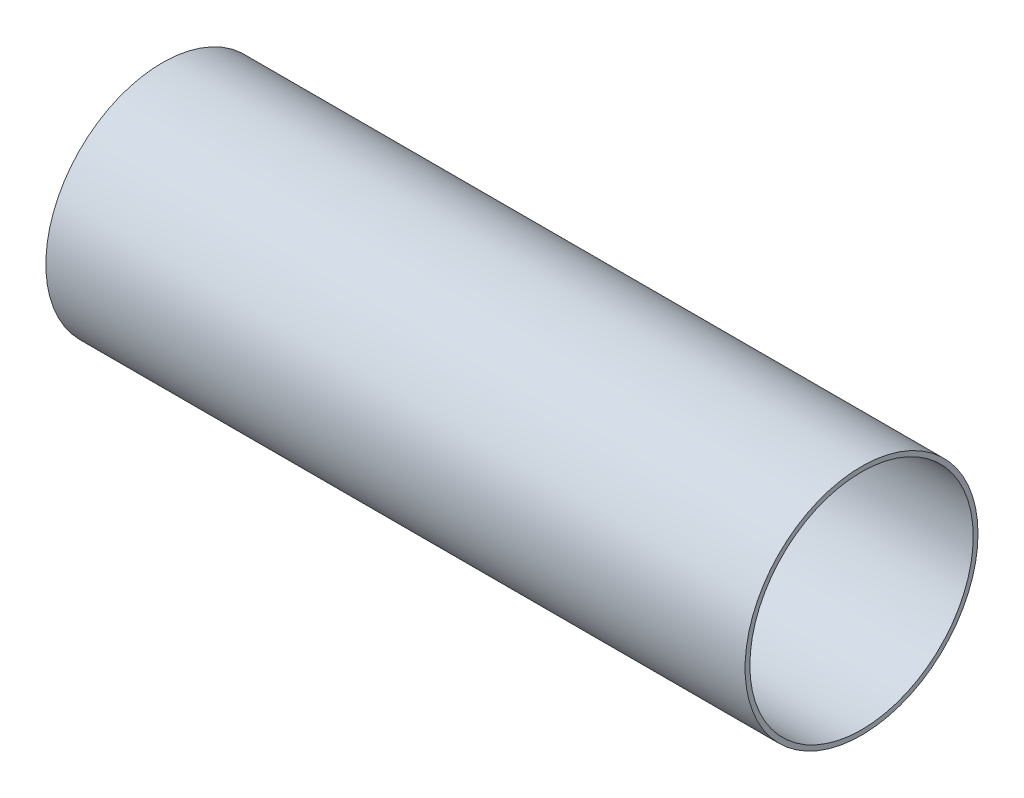
ISO-10303-21;
HEADER;
FILE_DESCRIPTION(('STEP AP214'),'2;1');
FILE_NAME('part.step','',(''),(''),'','','');
FILE_SCHEMA(('AUTOMOTIVE_DESIGN { 1 0 10303 214 1 1 1 1 }'));
ENDSEC;
DATA;
#1=APPLICATION_CONTEXT('core data for automotive mechanical design processes');
#2=APPLICATION_PROTOCOL_DEFINITION('international standard','automotive_design',2000,#1);
#3=PRODUCT_CONTEXT('',#1,'mechanical');
#4=PRODUCT('Part','Part','',(#3));
#5=PRODUCT_RELATED_PRODUCT_CATEGORY('part','',(#4));
#6=PRODUCT_DEFINITION_FORMATION('','',#4);
#7=PRODUCT_DEFINITION_CONTEXT('part definition',#1,'design');
#8=PRODUCT_DEFINITION('design','',#6,#7);
#9=PRODUCT_DEFINITION_SHAPE('','',#8);
#10=(LENGTH_UNIT() NAMED_UNIT(*) SI_UNIT(.MILLI.,.METRE.));
#11=(NAMED_UNIT(*) PLANE_ANGLE_UNIT() SI_UNIT($,.RADIAN.));
#12=(NAMED_UNIT(*) SI_UNIT($,.STERADIAN.) SOLID_ANGLE_UNIT());
#13=UNCERTAINTY_MEASURE_WITH_UNIT(LENGTH_MEASURE(1.E-05),#10,'distance_accuracy_value','');
#14=(GEOMETRIC_REPRESENTATION_CONTEXT(3) GLOBAL_UNCERTAINTY_ASSIGNED_CONTEXT((#13)) GLOBAL_UNIT_ASSIGNED_CONTEXT((#10,
#11,#12)) REPRESENTATION_CONTEXT('',''));
#15=CARTESIAN_POINT('',(0.,0.,0.));
#16=DIRECTION('',(0.,0.,1.));
#17=DIRECTION('',(1.,0.,0.));
#18=AXIS2_PLACEMENT_3D('',#15,#16,#17);
#19=CARTESIAN_POINT('',(228.6,0.,0.));
#20=DIRECTION('',(1.,0.,0.));
#21=DIRECTION('',(0.,0.,-1.));
#22=AXIS2_PLACEMENT_3D('',#19,#20,#21);
#23=PLANE('',#22);
#24=CARTESIAN_POINT('',(228.6,0.,0.));
#25=DIRECTION('',(1.,0.,0.));
#26=DIRECTION('',(0.,0.,-1.));
#27=AXIS2_PLACEMENT_3D('',#24,#25,#26);
#28=CIRCLE('',#27,38.0746);
#29=CARTESIAN_POINT('',(228.6,0.,-38.0746));
#30=VERTEX_POINT('',#29);
#31=EDGE_CURVE('E10',#30,#30,#28,.T.);
#32=ORIENTED_EDGE('',*,*,#31,.T.);
#33=EDGE_LOOP('',(#32));
#34=FACE_BOUND('',#33,.T.);
#35=CARTESIAN_POINT('',(228.6,0.,0.));
#36=DIRECTION('',(1.,0.,0.));
#37=DIRECTION('',(0.,0.,-1.));
#38=AXIS2_PLACEMENT_3D('',#35,#36,#37);
#39=CIRCLE('',#38,36.5125);
#40=CARTESIAN_POINT('',(228.6,0.,-36.5125));
#41=VERTEX_POINT('',#40);
#42=EDGE_CURVE('E56',#41,#41,#39,.T.);
#43=ORIENTED_EDGE('',*,*,#42,.F.);
#44=EDGE_LOOP('',(#43));
#45=FACE_BOUND('',#44,.T.);
#46=ADVANCED_FACE('F43',(#34,#45),#23,.T.);
#47=CARTESIAN_POINT('',(0.,0.,0.));
#48=DIRECTION('',(1.,0.,0.));
#49=DIRECTION('',(0.,0.,-1.));
#50=AXIS2_PLACEMENT_3D('',#47,#48,#49);
#51=PLANE('',#50);
#52=CARTESIAN_POINT('',(0.,0.,0.));
#53=DIRECTION('',(1.,0.,0.));
#54=DIRECTION('',(0.,0.,-1.));
#55=AXIS2_PLACEMENT_3D('',#52,#53,#54);
#56=CIRCLE('',#55,38.0746);
#57=CARTESIAN_POINT('',(0.,0.,-38.0746));
#58=VERTEX_POINT('',#57);
#59=EDGE_CURVE('E47',#58,#58,#56,.T.);
#60=ORIENTED_EDGE('',*,*,#59,.F.);
#61=EDGE_LOOP('',(#60));
#62=FACE_BOUND('',#61,.T.);
#63=CARTESIAN_POINT('',(0.,0.,0.));
#64=DIRECTION('',(1.,0.,0.));
#65=DIRECTION('',(0.,0.,-1.));
#66=AXIS2_PLACEMENT_3D('',#63,#64,#65);
#67=CIRCLE('',#66,36.5125);
#68=CARTESIAN_POINT('',(0.,0.,-36.5125));
#69=VERTEX_POINT('',#68);
#70=EDGE_CURVE('E58',#69,#69,#67,.T.);
#71=ORIENTED_EDGE('',*,*,#70,.T.);
#72=EDGE_LOOP('',(#71));
#73=FACE_BOUND('',#72,.T.);
#74=ADVANCED_FACE('F70',(#62,#73),#51,.F.);
#75=CARTESIAN_POINT('',(228.6,0.,0.));
#76=DIRECTION('',(-1.,0.,0.));
#77=DIRECTION('',(0.,0.,1.));
#78=AXIS2_PLACEMENT_3D('',#75,#76,#77);
#79=CYLINDRICAL_SURFACE('',#78,38.0746);
#80=ORIENTED_EDGE('',*,*,#31,.F.);
#81=EDGE_LOOP('',(#80));
#82=FACE_BOUND('',#81,.T.);
#83=ORIENTED_EDGE('',*,*,#59,.T.);
#84=EDGE_LOOP('',(#83));
#85=FACE_BOUND('',#84,.T.);
#86=ADVANCED_FACE('F45',(#82,#85),#79,.T.);
#87=CARTESIAN_POINT('',(228.6,0.,0.));
#88=DIRECTION('',(-1.,0.,0.));
#89=DIRECTION('',(0.,0.,1.));
#90=AXIS2_PLACEMENT_3D('',#87,#88,#89);
#91=CYLINDRICAL_SURFACE('',#90,36.5125);
#92=ORIENTED_EDGE('',*,*,#42,.T.);
#93=EDGE_LOOP('',(#92));
#94=FACE_BOUND('',#93,.T.);
#95=ORIENTED_EDGE('',*,*,#70,.F.);
#96=EDGE_LOOP('',(#95));
#97=FACE_BOUND('',#96,.T.);
#98=ADVANCED_FACE('F66',(#94,#97),#91,.F.);
#99=CLOSED_SHELL('',(#46,#74,#86,#98));
#100=MANIFOLD_SOLID_BREP('B2',#99);
#101=ADVANCED_BREP_SHAPE_REPRESENTATION('',(#18,#100),#14);
#102=SHAPE_DEFINITION_REPRESENTATION(#9,#101);
ENDSEC;
END-ISO-10303-21;
